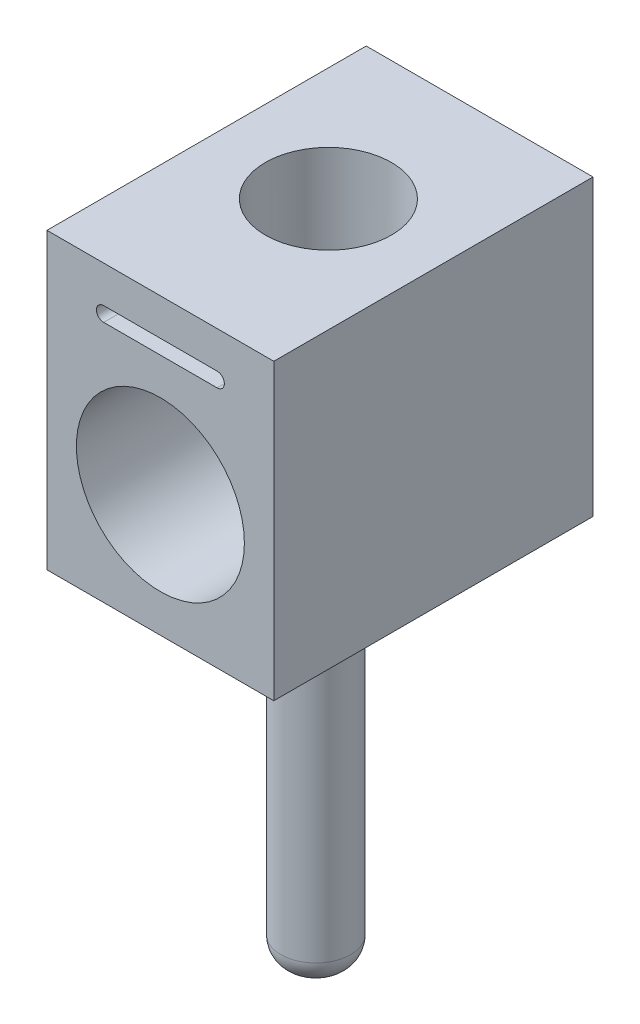
ISO-10303-21;
HEADER;
FILE_DESCRIPTION(('STEP AP214'),'2;1');
FILE_NAME('part.step','',(''),(''),'','','');
FILE_SCHEMA(('AUTOMOTIVE_DESIGN { 1 0 10303 214 1 1 1 1 }'));
ENDSEC;
DATA;
#1=APPLICATION_CONTEXT('core data for automotive mechanical design processes');
#2=APPLICATION_PROTOCOL_DEFINITION('international standard','automotive_design',2000,#1);
#3=PRODUCT_CONTEXT('',#1,'mechanical');
#4=PRODUCT('Part','Part','',(#3));
#5=PRODUCT_RELATED_PRODUCT_CATEGORY('part','',(#4));
#6=PRODUCT_DEFINITION_FORMATION('','',#4);
#7=PRODUCT_DEFINITION_CONTEXT('part definition',#1,'design');
#8=PRODUCT_DEFINITION('design','',#6,#7);
#9=PRODUCT_DEFINITION_SHAPE('','',#8);
#10=(LENGTH_UNIT() NAMED_UNIT(*) SI_UNIT(.MILLI.,.METRE.));
#11=(NAMED_UNIT(*) PLANE_ANGLE_UNIT() SI_UNIT($,.RADIAN.));
#12=(NAMED_UNIT(*) SI_UNIT($,.STERADIAN.) SOLID_ANGLE_UNIT());
#13=UNCERTAINTY_MEASURE_WITH_UNIT(LENGTH_MEASURE(1.E-05),#10,'distance_accuracy_value','');
#14=(GEOMETRIC_REPRESENTATION_CONTEXT(3) GLOBAL_UNCERTAINTY_ASSIGNED_CONTEXT((#13)) GLOBAL_UNIT_ASSIGNED_CONTEXT((#10,
#11,#12)) REPRESENTATION_CONTEXT('',''));
#15=CARTESIAN_POINT('',(0.,0.,0.));
#16=DIRECTION('',(0.,0.,1.));
#17=DIRECTION('',(1.,0.,0.));
#18=AXIS2_PLACEMENT_3D('',#15,#16,#17);
#19=CARTESIAN_POINT('',(-1.35,-1.75,-3.8));
#20=DIRECTION('',(0.,-1.,0.));
#21=DIRECTION('',(0.,0.,-1.));
#22=AXIS2_PLACEMENT_3D('',#19,#20,#21);
#23=PLANE('',#22);
#24=CARTESIAN_POINT('',(0.,-1.75,-1.85));
#25=DIRECTION('',(0.,-1.,0.));
#26=DIRECTION('',(0.,0.,-1.));
#27=AXIS2_PLACEMENT_3D('',#24,#25,#26);
#28=CIRCLE('',#27,0.515);
#29=CARTESIAN_POINT('',(0.,-1.75,-2.365));
#30=VERTEX_POINT('',#29);
#31=EDGE_CURVE('E12',#30,#30,#28,.F.);
#32=ORIENTED_EDGE('',*,*,#31,.T.);
#33=EDGE_LOOP('',(#32));
#34=FACE_BOUND('',#33,.T.);
#35=DIRECTION('',(1.,0.,0.));
#36=VECTOR('',#35,1.);
#37=CARTESIAN_POINT('',(-1.35,-1.75,0.));
#38=LINE('',#37,#36);
#39=CARTESIAN_POINT('',(-1.35,-1.75,0.));
#40=VERTEX_POINT('',#39);
#41=CARTESIAN_POINT('',(1.35,-1.75,0.));
#42=VERTEX_POINT('',#41);
#43=EDGE_CURVE('E158',#40,#42,#38,.T.);
#44=ORIENTED_EDGE('',*,*,#43,.F.);
#45=DIRECTION('',(0.,0.,1.));
#46=VECTOR('',#45,1.);
#47=CARTESIAN_POINT('',(-1.35,-1.75,-3.8));
#48=LINE('',#47,#46);
#49=CARTESIAN_POINT('',(-1.35,-1.75,-3.8));
#50=VERTEX_POINT('',#49);
#51=EDGE_CURVE('E176',#50,#40,#48,.T.);
#52=ORIENTED_EDGE('',*,*,#51,.F.);
#53=DIRECTION('',(1.,0.,0.));
#54=VECTOR('',#53,1.);
#55=CARTESIAN_POINT('',(-1.35,-1.75,-3.8));
#56=LINE('',#55,#54);
#57=CARTESIAN_POINT('',(1.35,-1.75,-3.8));
#58=VERTEX_POINT('',#57);
#59=EDGE_CURVE('E163',#50,#58,#56,.T.);
#60=ORIENTED_EDGE('',*,*,#59,.T.);
#61=DIRECTION('',(0.,0.,1.));
#62=VECTOR('',#61,1.);
#63=CARTESIAN_POINT('',(1.35,-1.75,-3.8));
#64=LINE('',#63,#62);
#65=EDGE_CURVE('E60',#58,#42,#64,.T.);
#66=ORIENTED_EDGE('',*,*,#65,.T.);
#67=EDGE_LOOP('',(#44,#52,#60,#66));
#68=FACE_BOUND('',#67,.T.);
#69=ADVANCED_FACE('F36',(#34,#68),#23,.T.);
#70=CARTESIAN_POINT('',(1.35,1.75,-3.8));
#71=DIRECTION('',(1.,0.,0.));
#72=DIRECTION('',(0.,1.,0.));
#73=AXIS2_PLACEMENT_3D('',#70,#71,#72);
#74=PLANE('',#73);
#75=DIRECTION('',(0.,0.,1.));
#76=VECTOR('',#75,1.);
#77=CARTESIAN_POINT('',(1.35,1.75,-3.8));
#78=LINE('',#77,#76);
#79=CARTESIAN_POINT('',(1.35,1.75,-3.8));
#80=VERTEX_POINT('',#79);
#81=CARTESIAN_POINT('',(1.35,1.75,0.));
#82=VERTEX_POINT('',#81);
#83=EDGE_CURVE('E165',#80,#82,#78,.T.);
#84=ORIENTED_EDGE('',*,*,#83,.T.);
#85=DIRECTION('',(0.,1.,0.));
#86=VECTOR('',#85,1.);
#87=CARTESIAN_POINT('',(1.35,1.75,0.));
#88=LINE('',#87,#86);
#89=EDGE_CURVE('E152',#42,#82,#88,.T.);
#90=ORIENTED_EDGE('',*,*,#89,.F.);
#91=ORIENTED_EDGE('',*,*,#65,.F.);
#92=DIRECTION('',(0.,1.,0.));
#93=VECTOR('',#92,1.);
#94=CARTESIAN_POINT('',(1.35,1.75,-3.8));
#95=LINE('',#94,#93);
#96=EDGE_CURVE('E83',#58,#80,#95,.T.);
#97=ORIENTED_EDGE('',*,*,#96,.T.);
#98=EDGE_LOOP('',(#84,#90,#91,#97));
#99=FACE_BOUND('',#98,.T.);
#100=ADVANCED_FACE('F226',(#99),#74,.T.);
#101=CARTESIAN_POINT('',(-1.35,1.75,-3.8));
#102=DIRECTION('',(-1.,0.,0.));
#103=DIRECTION('',(0.,-1.,0.));
#104=AXIS2_PLACEMENT_3D('',#101,#102,#103);
#105=PLANE('',#104);
#106=DIRECTION('',(0.,-1.,0.));
#107=VECTOR('',#106,1.);
#108=CARTESIAN_POINT('',(-1.35,1.75,-3.8));
#109=LINE('',#108,#107);
#110=CARTESIAN_POINT('',(-1.35,1.75,-3.8));
#111=VERTEX_POINT('',#110);
#112=EDGE_CURVE('E161',#111,#50,#109,.T.);
#113=ORIENTED_EDGE('',*,*,#112,.T.);
#114=ORIENTED_EDGE('',*,*,#51,.T.);
#115=DIRECTION('',(0.,-1.,0.));
#116=VECTOR('',#115,1.);
#117=CARTESIAN_POINT('',(-1.35,1.75,0.));
#118=LINE('',#117,#116);
#119=CARTESIAN_POINT('',(-1.35,1.75,0.));
#120=VERTEX_POINT('',#119);
#121=EDGE_CURVE('E170',#120,#40,#118,.T.);
#122=ORIENTED_EDGE('',*,*,#121,.F.);
#123=DIRECTION('',(0.,0.,1.));
#124=VECTOR('',#123,1.);
#125=CARTESIAN_POINT('',(-1.35,1.75,-3.8));
#126=LINE('',#125,#124);
#127=EDGE_CURVE('E179',#111,#120,#126,.T.);
#128=ORIENTED_EDGE('',*,*,#127,.F.);
#129=EDGE_LOOP('',(#113,#114,#122,#128));
#130=FACE_BOUND('',#129,.T.);
#131=ADVANCED_FACE('F233',(#130),#105,.T.);
#132=CARTESIAN_POINT('',(-1.35,1.75,-3.8));
#133=DIRECTION('',(0.,1.,0.));
#134=DIRECTION('',(0.,0.,1.));
#135=AXIS2_PLACEMENT_3D('',#132,#133,#134);
#136=PLANE('',#135);
#137=CARTESIAN_POINT('',(0.,1.75,-2.));
#138=DIRECTION('',(0.,1.,0.));
#139=DIRECTION('',(0.,0.,1.));
#140=AXIS2_PLACEMENT_3D('',#137,#138,#139);
#141=CIRCLE('',#140,0.75);
#142=CARTESIAN_POINT('',(0.,1.75,-1.25));
#143=VERTEX_POINT('',#142);
#144=EDGE_CURVE('E142',#143,#143,#141,.T.);
#145=ORIENTED_EDGE('',*,*,#144,.F.);
#146=EDGE_LOOP('',(#145));
#147=FACE_BOUND('',#146,.T.);
#148=DIRECTION('',(-1.,0.,0.));
#149=VECTOR('',#148,1.);
#150=CARTESIAN_POINT('',(-1.35,1.75,0.));
#151=LINE('',#150,#149);
#152=EDGE_CURVE('E167',#82,#120,#151,.T.);
#153=ORIENTED_EDGE('',*,*,#152,.F.);
#154=ORIENTED_EDGE('',*,*,#83,.F.);
#155=DIRECTION('',(-1.,0.,0.));
#156=VECTOR('',#155,1.);
#157=CARTESIAN_POINT('',(-1.35,1.75,-3.8));
#158=LINE('',#157,#156);
#159=EDGE_CURVE('E157',#80,#111,#158,.T.);
#160=ORIENTED_EDGE('',*,*,#159,.T.);
#161=ORIENTED_EDGE('',*,*,#127,.T.);
#162=EDGE_LOOP('',(#153,#154,#160,#161));
#163=FACE_BOUND('',#162,.T.);
#164=ADVANCED_FACE('F240',(#147,#163),#136,.T.);
#165=CARTESIAN_POINT('',(0.,0.,-3.8));
#166=DIRECTION('',(0.,0.,1.));
#167=DIRECTION('',(1.,0.,0.));
#168=AXIS2_PLACEMENT_3D('',#165,#166,#167);
#169=PLANE('',#168);
#170=CARTESIAN_POINT('',(0.,-0.3,-3.8));
#171=DIRECTION('',(0.,0.,1.));
#172=DIRECTION('',(1.,0.,0.));
#173=AXIS2_PLACEMENT_3D('',#170,#171,#172);
#174=CIRCLE('',#173,1.);
#175=CARTESIAN_POINT('',(1.,-0.3,-3.8));
#176=VERTEX_POINT('',#175);
#177=EDGE_CURVE('E149',#176,#176,#174,.T.);
#178=ORIENTED_EDGE('',*,*,#177,.T.);
#179=EDGE_LOOP('',(#178));
#180=FACE_BOUND('',#179,.T.);
#181=ORIENTED_EDGE('',*,*,#159,.F.);
#182=ORIENTED_EDGE('',*,*,#96,.F.);
#183=ORIENTED_EDGE('',*,*,#59,.F.);
#184=ORIENTED_EDGE('',*,*,#112,.F.);
#185=EDGE_LOOP('',(#181,#182,#183,#184));
#186=FACE_BOUND('',#185,.T.);
#187=ADVANCED_FACE('F243',(#180,#186),#169,.F.);
#188=CARTESIAN_POINT('',(0.,0.,0.));
#189=DIRECTION('',(0.,0.,1.));
#190=DIRECTION('',(1.,0.,0.));
#191=AXIS2_PLACEMENT_3D('',#188,#189,#190);
#192=PLANE('',#191);
#193=CARTESIAN_POINT('',(-0.675,1.225,0.));
#194=DIRECTION('',(0.,0.,1.));
#195=DIRECTION('',(1.,0.,0.));
#196=AXIS2_PLACEMENT_3D('',#193,#194,#195);
#197=CIRCLE('',#196,0.0864136089338847);
#198=CARTESIAN_POINT('',(-0.675,1.31141360893388,0.));
#199=VERTEX_POINT('',#198);
#200=CARTESIAN_POINT('',(-0.675,1.13858639106611,0.));
#201=VERTEX_POINT('',#200);
#202=EDGE_CURVE('E51',#199,#201,#197,.T.);
#203=ORIENTED_EDGE('',*,*,#202,.F.);
#204=DIRECTION('',(-1.,0.,0.));
#205=VECTOR('',#204,1.);
#206=CARTESIAN_POINT('',(-0.675,1.31141360893388,0.));
#207=LINE('',#206,#205);
#208=CARTESIAN_POINT('',(0.675,1.31141360893388,0.));
#209=VERTEX_POINT('',#208);
#210=EDGE_CURVE('E127',#209,#199,#207,.T.);
#211=ORIENTED_EDGE('',*,*,#210,.F.);
#212=CARTESIAN_POINT('',(0.675,1.225,0.));
#213=DIRECTION('',(0.,0.,1.));
#214=DIRECTION('',(1.,0.,0.));
#215=AXIS2_PLACEMENT_3D('',#212,#213,#214);
#216=CIRCLE('',#215,0.0864136089338847);
#217=CARTESIAN_POINT('',(0.675,1.13858639106612,0.));
#218=VERTEX_POINT('',#217);
#219=EDGE_CURVE('E130',#218,#209,#216,.T.);
#220=ORIENTED_EDGE('',*,*,#219,.F.);
#221=DIRECTION('',(1.,0.,0.));
#222=VECTOR('',#221,1.);
#223=CARTESIAN_POINT('',(-0.675,1.13858639106611,0.));
#224=LINE('',#223,#222);
#225=EDGE_CURVE('E136',#201,#218,#224,.T.);
#226=ORIENTED_EDGE('',*,*,#225,.F.);
#227=EDGE_LOOP('',(#203,#211,#220,#226));
#228=FACE_BOUND('',#227,.T.);
#229=CARTESIAN_POINT('',(0.,-0.3,0.));
#230=DIRECTION('',(0.,0.,1.));
#231=DIRECTION('',(1.,0.,0.));
#232=AXIS2_PLACEMENT_3D('',#229,#230,#231);
#233=CIRCLE('',#232,1.);
#234=CARTESIAN_POINT('',(1.,-0.3,0.));
#235=VERTEX_POINT('',#234);
#236=EDGE_CURVE('E153',#235,#235,#233,.T.);
#237=ORIENTED_EDGE('',*,*,#236,.F.);
#238=EDGE_LOOP('',(#237));
#239=FACE_BOUND('',#238,.T.);
#240=ORIENTED_EDGE('',*,*,#89,.T.);
#241=ORIENTED_EDGE('',*,*,#152,.T.);
#242=ORIENTED_EDGE('',*,*,#121,.T.);
#243=ORIENTED_EDGE('',*,*,#43,.T.);
#244=EDGE_LOOP('',(#240,#241,#242,#243));
#245=FACE_BOUND('',#244,.T.);
#246=ADVANCED_FACE('F237',(#228,#239,#245),#192,.T.);
#247=CARTESIAN_POINT('',(0.,-0.3,-3.8));
#248=DIRECTION('',(0.,0.,1.));
#249=DIRECTION('',(1.,0.,0.));
#250=AXIS2_PLACEMENT_3D('',#247,#248,#249);
#251=CYLINDRICAL_SURFACE('',#250,1.);
#252=CARTESIAN_POINT('',(0.,0.7,-1.25));
#253=CARTESIAN_POINT('',(0.0366202144012363,0.699995549924329,-1.25000473534807));
#254=CARTESIAN_POINT('',(0.0732831719538211,0.697967650692158,-1.25270313962658));
#255=CARTESIAN_POINT('',(0.145465550551888,0.690033614797004,-1.26333290268625));
#256=CARTESIAN_POINT('',(0.180981860536906,0.684117727976345,-1.27127741771765));
#257=CARTESIAN_POINT('',(0.249618016635631,0.668978221133335,-1.29185662173774));
#258=CARTESIAN_POINT('',(0.282750996692572,0.659774718373225,-1.30446280168529));
#259=CARTESIAN_POINT('',(0.346210978824908,0.638752824883222,-1.33377112720603));
#260=CARTESIAN_POINT('',(0.376538798175682,0.626935199195139,-1.35047207457087));
#261=CARTESIAN_POINT('',(0.436733026399872,0.600247710135603,-1.38913151948125));
#262=CARTESIAN_POINT('',(0.466296630176021,0.585196539347365,-1.41143366835905));
#263=CARTESIAN_POINT('',(0.521513568274128,0.553835092817011,-1.45974791498282));
#264=CARTESIAN_POINT('',(0.547160736840208,0.537522891380569,-1.48576574032586));
#265=CARTESIAN_POINT('',(0.599185812622842,0.501355617071726,-1.54679147793153));
#266=CARTESIAN_POINT('',(0.624652893542543,0.481454274009925,-1.58255183890201));
#267=CARTESIAN_POINT('',(0.669309989447192,0.443557223633513,-1.65872550584258));
#268=CARTESIAN_POINT('',(0.688508584605921,0.425558934483913,-1.69913234842712));
#269=CARTESIAN_POINT('',(0.71440313926206,0.399885775857877,-1.76975141938605));
#270=CARTESIAN_POINT('',(0.723128372337555,0.390788755925942,-1.79869534857622));
#271=CARTESIAN_POINT('',(0.737103362769485,0.375857970761133,-1.85819636738046));
#272=CARTESIAN_POINT('',(0.742361076759834,0.370016739542133,-1.88874958893716));
#273=CARTESIAN_POINT('',(0.749064110723876,0.362518798434896,-1.95109129276563));
#274=CARTESIAN_POINT('',(0.750474774282209,0.360900133439581,-1.98288840335078));
#275=CARTESIAN_POINT('',(0.749241066198164,0.362297658823725,-2.04630745545204));
#276=CARTESIAN_POINT('',(0.746595240758686,0.365315510876204,-2.07792933008898));
#277=CARTESIAN_POINT('',(0.737988696485991,0.374838116502368,-2.13659567366212));
#278=CARTESIAN_POINT('',(0.732412431994231,0.380935785974531,-2.16376818535869));
#279=CARTESIAN_POINT('',(0.718528355694913,0.395570964919252,-2.21671943919577));
#280=CARTESIAN_POINT('',(0.710217918434353,0.404110818431617,-2.24249681386061));
#281=CARTESIAN_POINT('',(0.685165320811544,0.42870884610599,-2.30812819341289));
#282=CARTESIAN_POINT('',(0.666400742456174,0.446128245598029,-2.34670020834748));
#283=CARTESIAN_POINT('',(0.623090116586354,0.482666490824355,-2.41959826190876));
#284=CARTESIAN_POINT('',(0.598530021283118,0.501789394457194,-2.45391366962035));
#285=CARTESIAN_POINT('',(0.543258020506854,0.540258361538407,-2.51887669520899));
#286=CARTESIAN_POINT('',(0.512406877629166,0.559597933643939,-2.54941030344265));
#287=CARTESIAN_POINT('',(0.445211260855806,0.596240189912107,-2.60513182338868));
#288=CARTESIAN_POINT('',(0.408877527147119,0.61354674132054,-2.63032996011473));
#289=CARTESIAN_POINT('',(0.338951040226875,0.641398630366826,-2.66999039962053));
#290=CARTESIAN_POINT('',(0.306269935092756,0.652603854724669,-2.68559229710799));
#291=CARTESIAN_POINT('',(0.238176086601093,0.67186452208511,-2.71211244023183));
#292=CARTESIAN_POINT('',(0.202765070531895,0.679921937521858,-2.72303361924961));
#293=CARTESIAN_POINT('',(0.129838116241743,0.692227943179846,-2.73962668144325));
#294=CARTESIAN_POINT('',(0.092310640702966,0.696452964858719,-2.74526608946932));
#295=CARTESIAN_POINT('',(0.0166006198984609,0.70057941829725,-2.75077479868585));
#296=CARTESIAN_POINT('',(-0.0215816421863622,0.700482674227045,-2.75064653434768));
#297=CARTESIAN_POINT('',(-0.093402108664815,0.69621273587936,-2.74494456536341));
#298=CARTESIAN_POINT('',(-0.127111163773068,0.692450433002003,-2.73991973155566));
#299=CARTESIAN_POINT('',(-0.19305533530456,0.68175660100794,-2.72551310999607));
#300=CARTESIAN_POINT('',(-0.225290136493632,0.674824397536309,-2.71613039515529));
#301=CARTESIAN_POINT('',(-0.288708389844886,0.657999153416566,-2.69305623470345));
#302=CARTESIAN_POINT('',(-0.319814586268069,0.648010251450967,-2.6792244092863));
#303=CARTESIAN_POINT('',(-0.379259263521539,0.625834927059812,-2.6479137722872));
#304=CARTESIAN_POINT('',(-0.407597360668208,0.613648200660336,-2.63043445618013));
#305=CARTESIAN_POINT('',(-0.465755813159513,0.585595734432497,-2.58910837679472));
#306=CARTESIAN_POINT('',(-0.495033381349327,0.569455475125192,-2.56468573028126));
#307=CARTESIAN_POINT('',(-0.549359874279295,0.536194764373915,-2.51199562370581));
#308=CARTESIAN_POINT('',(-0.574399152347978,0.519072192536943,-2.48371965015335));
#309=CARTESIAN_POINT('',(-0.62438770537802,0.481845641457518,-2.41792505951937));
#310=CARTESIAN_POINT('',(-0.648415218243071,0.461793592600648,-2.37967121925368));
#311=CARTESIAN_POINT('',(-0.689616179991866,0.424702956742105,-2.29831996101394));
#312=CARTESIAN_POINT('',(-0.706810002579291,0.407655497854296,-2.25523743904634));
#313=CARTESIAN_POINT('',(-0.728078671282801,0.385594389043247,-2.18229277556238));
#314=CARTESIAN_POINT('',(-0.734655047561809,0.378479059123847,-2.15380443679764));
#315=CARTESIAN_POINT('',(-0.744457610912695,0.367710280514029,-2.09564647650957));
#316=CARTESIAN_POINT('',(-0.747691276007807,0.364049106097411,-2.06597964660315));
#317=CARTESIAN_POINT('',(-0.750576601033655,0.360788008964814,-2.00608546009004));
#318=CARTESIAN_POINT('',(-0.750210076582722,0.361208703438968,-1.97585602847917));
#319=CARTESIAN_POINT('',(-0.74588441923474,0.36608224270422,-1.91597158063999));
#320=CARTESIAN_POINT('',(-0.741920650285916,0.370540290734719,-1.88631735611138));
#321=CARTESIAN_POINT('',(-0.729469208900039,0.384086744053065,-1.8220427142215));
#322=CARTESIAN_POINT('',(-0.720182838954333,0.393973530017116,-1.78775140963312));
#323=CARTESIAN_POINT('',(-0.697348137148892,0.416914816662478,-1.72173257588601));
#324=CARTESIAN_POINT('',(-0.683789039566413,0.42997729973955,-1.69001178011397));
#325=CARTESIAN_POINT('',(-0.647494590522783,0.462582387984412,-1.61873968323072));
#326=CARTESIAN_POINT('',(-0.62320769235656,0.482801021766621,-1.58028920200535));
#327=CARTESIAN_POINT('',(-0.568253610319043,0.52356754509007,-1.50843698413391));
#328=CARTESIAN_POINT('',(-0.53758074162965,0.54411571283823,-1.47503979200132));
#329=CARTESIAN_POINT('',(-0.469813504073434,0.583644966812501,-1.41358405367889));
#330=CARTESIAN_POINT('',(-0.432668324359605,0.602611751461281,-1.38557174591106));
#331=CARTESIAN_POINT('',(-0.35257980527157,0.636786365634487,-1.33638856860002));
#332=CARTESIAN_POINT('',(-0.309650664114993,0.652003149546709,-1.31520136389219));
#333=CARTESIAN_POINT('',(-0.232419470733686,0.673183741180643,-1.28610004121395));
#334=CARTESIAN_POINT('',(-0.19927463266858,0.680552315625429,-1.27611583370066));
#335=CARTESIAN_POINT('',(-0.131422973804692,0.691917998699978,-1.26079184705597));
#336=CARTESIAN_POINT('',(-0.0967208035042929,0.695924522226515,-1.25543909693557));
#337=CARTESIAN_POINT('',(-0.0412269601856745,0.699363449511954,-1.25084873150009));
#338=CARTESIAN_POINT('',(-0.020620256240996,0.70000250576634,-1.24999733360134));
#339=CARTESIAN_POINT('',(0.,0.7,-1.25));
#340=B_SPLINE_CURVE_WITH_KNOTS('',3,(#252,#253,#254,#255,#256,#257,#258,#259,#260,#261,#262,
#263,#264,#265,#266,#267,#268,#269,#270,#271,#272,#273,#274,#275,#276,#277,#278,#279,#280,#281,
#282,#283,#284,#285,#286,#287,#288,#289,#290,#291,#292,#293,#294,#295,#296,#297,#298,#299,#300,
#301,#302,#303,#304,#305,#306,#307,#308,#309,#310,#311,#312,#313,#314,#315,#316,#317,#318,#319,
#320,#321,#322,#323,#324,#325,#326,#327,#328,#329,#330,#331,#332,#333,#334,#335,#336,#337,#338,
#339),.UNSPECIFIED.,.T.,.F.,(4,2,2,2,2,2,2,2,2,2,2,2,2,2,2,2,2,2,2,2,2,2,2,2,2,2,2,2,2,2,2,2,2,
2,2,2,2,2,2,2,2,2,2,4),(0.,0.109785893286021,0.219848159711622,0.329248166786691,
0.438616199424646,0.558112156587148,0.677794342025812,0.821800079437255,0.965607870282533,
1.05999759264951,1.15416996597645,1.24918793810628,1.34423997150105,1.42913445078177,
1.51411068794507,1.65224665897142,1.79072096173131,1.93267941963232,2.07436331241032,
2.18763252497381,2.30083064815745,2.41472029077636,2.52856186227493,2.63095593500184,
2.73337180087093,2.83940219736027,2.94544726982957,3.06920191035121,3.19323454486913,
3.3408429800216,3.48800797919243,3.57794580705653,3.66768199551291,3.75787166921557,
3.84817774276114,3.95819835474254,4.06849842564147,4.21706123322071,4.36575686189633,
4.51567724740512,4.66523610130769,4.77097848765001,4.87642376135815,4.93824243959963),.UNSPECIFIED.);
#341=CARTESIAN_POINT('',(0.,0.7,-1.25));
#342=VERTEX_POINT('',#341);
#343=EDGE_CURVE('E148',#342,#342,#340,.T.);
#344=ORIENTED_EDGE('',*,*,#343,.T.);
#345=EDGE_LOOP('',(#344));
#346=FACE_BOUND('',#345,.T.);
#347=ORIENTED_EDGE('',*,*,#177,.F.);
#348=EDGE_LOOP('',(#347));
#349=FACE_BOUND('',#348,.T.);
#350=ORIENTED_EDGE('',*,*,#236,.T.);
#351=EDGE_LOOP('',(#350));
#352=FACE_BOUND('',#351,.T.);
#353=ADVANCED_FACE('F189',(#346,#349,#352),#251,.F.);
#354=CARTESIAN_POINT('',(0.,-0.0999999999999983,-2.));
#355=DIRECTION('',(0.,1.,0.));
#356=DIRECTION('',(0.,0.,1.));
#357=AXIS2_PLACEMENT_3D('',#354,#355,#356);
#358=CYLINDRICAL_SURFACE('',#357,0.75);
#359=ORIENTED_EDGE('',*,*,#144,.T.);
#360=EDGE_LOOP('',(#359));
#361=FACE_BOUND('',#360,.T.);
#362=ORIENTED_EDGE('',*,*,#343,.F.);
#363=EDGE_LOOP('',(#362));
#364=FACE_BOUND('',#363,.T.);
#365=ADVANCED_FACE('F192',(#361,#364),#358,.F.);
#366=CARTESIAN_POINT('',(-0.675,1.225,-0.5));
#367=DIRECTION('',(0.,0.,1.));
#368=DIRECTION('',(1.,0.,0.));
#369=AXIS2_PLACEMENT_3D('',#366,#367,#368);
#370=CYLINDRICAL_SURFACE('',#369,0.0864136089338847);
#371=ORIENTED_EDGE('',*,*,#202,.T.);
#372=DIRECTION('',(0.,0.,1.));
#373=VECTOR('',#372,1.);
#374=CARTESIAN_POINT('',(-0.675,1.13858639106611,-0.5));
#375=LINE('',#374,#373);
#376=CARTESIAN_POINT('',(-0.675,1.13858639106611,-0.5));
#377=VERTEX_POINT('',#376);
#378=EDGE_CURVE('E105',#377,#201,#375,.T.);
#379=ORIENTED_EDGE('',*,*,#378,.F.);
#380=CARTESIAN_POINT('',(-0.675,1.225,-0.5));
#381=DIRECTION('',(0.,0.,1.));
#382=DIRECTION('',(1.,0.,0.));
#383=AXIS2_PLACEMENT_3D('',#380,#381,#382);
#384=CIRCLE('',#383,0.0864136089338847);
#385=CARTESIAN_POINT('',(-0.675,1.31141360893388,-0.5));
#386=VERTEX_POINT('',#385);
#387=EDGE_CURVE('E109',#386,#377,#384,.T.);
#388=ORIENTED_EDGE('',*,*,#387,.F.);
#389=DIRECTION('',(0.,0.,1.));
#390=VECTOR('',#389,1.);
#391=CARTESIAN_POINT('',(-0.675,1.31141360893388,-0.5));
#392=LINE('',#391,#390);
#393=EDGE_CURVE('E140',#386,#199,#392,.T.);
#394=ORIENTED_EDGE('',*,*,#393,.T.);
#395=EDGE_LOOP('',(#371,#379,#388,#394));
#396=FACE_BOUND('',#395,.T.);
#397=ADVANCED_FACE('F107',(#396),#370,.F.);
#398=CARTESIAN_POINT('',(-0.675,1.31141360893388,-0.5));
#399=DIRECTION('',(0.,1.,0.));
#400=DIRECTION('',(-1.,0.,0.));
#401=AXIS2_PLACEMENT_3D('',#398,#399,#400);
#402=PLANE('',#401);
#403=ORIENTED_EDGE('',*,*,#210,.T.);
#404=ORIENTED_EDGE('',*,*,#393,.F.);
#405=DIRECTION('',(-1.,0.,0.));
#406=VECTOR('',#405,1.);
#407=CARTESIAN_POINT('',(-0.675,1.31141360893388,-0.5));
#408=LINE('',#407,#406);
#409=CARTESIAN_POINT('',(0.675,1.31141360893388,-0.5));
#410=VERTEX_POINT('',#409);
#411=EDGE_CURVE('E115',#410,#386,#408,.T.);
#412=ORIENTED_EDGE('',*,*,#411,.F.);
#413=DIRECTION('',(0.,0.,1.));
#414=VECTOR('',#413,1.);
#415=CARTESIAN_POINT('',(0.675,1.31141360893388,-0.5));
#416=LINE('',#415,#414);
#417=EDGE_CURVE('E143',#410,#209,#416,.T.);
#418=ORIENTED_EDGE('',*,*,#417,.T.);
#419=EDGE_LOOP('',(#403,#404,#412,#418));
#420=FACE_BOUND('',#419,.T.);
#421=ADVANCED_FACE('F199',(#420),#402,.F.);
#422=CARTESIAN_POINT('',(0.675,1.225,-0.5));
#423=DIRECTION('',(0.,0.,1.));
#424=DIRECTION('',(1.,0.,0.));
#425=AXIS2_PLACEMENT_3D('',#422,#423,#424);
#426=CYLINDRICAL_SURFACE('',#425,0.0864136089338847);
#427=ORIENTED_EDGE('',*,*,#219,.T.);
#428=ORIENTED_EDGE('',*,*,#417,.F.);
#429=CARTESIAN_POINT('',(0.675,1.225,-0.5));
#430=DIRECTION('',(0.,0.,1.));
#431=DIRECTION('',(1.,0.,0.));
#432=AXIS2_PLACEMENT_3D('',#429,#430,#431);
#433=CIRCLE('',#432,0.0864136089338847);
#434=CARTESIAN_POINT('',(0.675,1.13858639106612,-0.5));
#435=VERTEX_POINT('',#434);
#436=EDGE_CURVE('E123',#435,#410,#433,.T.);
#437=ORIENTED_EDGE('',*,*,#436,.F.);
#438=DIRECTION('',(0.,0.,1.));
#439=VECTOR('',#438,1.);
#440=CARTESIAN_POINT('',(0.675,1.13858639106612,-0.5));
#441=LINE('',#440,#439);
#442=EDGE_CURVE('E114',#435,#218,#441,.T.);
#443=ORIENTED_EDGE('',*,*,#442,.T.);
#444=EDGE_LOOP('',(#427,#428,#437,#443));
#445=FACE_BOUND('',#444,.T.);
#446=ADVANCED_FACE('F202',(#445),#426,.F.);
#447=CARTESIAN_POINT('',(-0.675,1.13858639106611,-0.5));
#448=DIRECTION('',(0.,-1.,0.));
#449=DIRECTION('',(1.,0.,0.));
#450=AXIS2_PLACEMENT_3D('',#447,#448,#449);
#451=PLANE('',#450);
#452=ORIENTED_EDGE('',*,*,#225,.T.);
#453=ORIENTED_EDGE('',*,*,#442,.F.);
#454=DIRECTION('',(1.,0.,0.));
#455=VECTOR('',#454,1.);
#456=CARTESIAN_POINT('',(-0.675,1.13858639106611,-0.5));
#457=LINE('',#456,#455);
#458=EDGE_CURVE('E118',#377,#435,#457,.T.);
#459=ORIENTED_EDGE('',*,*,#458,.F.);
#460=ORIENTED_EDGE('',*,*,#378,.T.);
#461=EDGE_LOOP('',(#452,#453,#459,#460));
#462=FACE_BOUND('',#461,.T.);
#463=ADVANCED_FACE('F119',(#462),#451,.F.);
#464=CARTESIAN_POINT('',(-0.675,1.225,-0.5));
#465=DIRECTION('',(0.,0.,1.));
#466=DIRECTION('',(1.,0.,0.));
#467=AXIS2_PLACEMENT_3D('',#464,#465,#466);
#468=PLANE('',#467);
#469=ORIENTED_EDGE('',*,*,#387,.T.);
#470=ORIENTED_EDGE('',*,*,#458,.T.);
#471=ORIENTED_EDGE('',*,*,#436,.T.);
#472=ORIENTED_EDGE('',*,*,#411,.T.);
#473=EDGE_LOOP('',(#469,#470,#471,#472));
#474=FACE_BOUND('',#473,.T.);
#475=ADVANCED_FACE('F125',(#474),#468,.T.);
#476=CARTESIAN_POINT('',(0.,-6.06,-1.85));
#477=DIRECTION('',(0.,1.,0.));
#478=DIRECTION('',(0.,0.,1.));
#479=AXIS2_PLACEMENT_3D('',#476,#477,#478);
#480=CYLINDRICAL_SURFACE('',#479,0.415);
#481=CARTESIAN_POINT('',(0.,-1.85,-1.85));
#482=DIRECTION('',(0.,-1.,0.));
#483=DIRECTION('',(0.,0.,-1.));
#484=AXIS2_PLACEMENT_3D('',#481,#482,#483);
#485=CIRCLE('',#484,0.415);
#486=CARTESIAN_POINT('',(0.,-1.85,-2.265));
#487=VERTEX_POINT('',#486);
#488=EDGE_CURVE('E44',#487,#487,#485,.T.);
#489=ORIENTED_EDGE('',*,*,#488,.T.);
#490=EDGE_LOOP('',(#489));
#491=FACE_BOUND('',#490,.T.);
#492=CARTESIAN_POINT('',(0.,-5.76,-1.85));
#493=DIRECTION('',(0.,-1.,0.));
#494=DIRECTION('',(0.,0.,-1.));
#495=AXIS2_PLACEMENT_3D('',#492,#493,#494);
#496=CIRCLE('',#495,0.415);
#497=CARTESIAN_POINT('',(0.,-5.76,-2.265));
#498=VERTEX_POINT('',#497);
#499=EDGE_CURVE('E336',#498,#498,#496,.F.);
#500=ORIENTED_EDGE('',*,*,#499,.T.);
#501=EDGE_LOOP('',(#500));
#502=FACE_BOUND('',#501,.T.);
#503=ADVANCED_FACE('F211',(#491,#502),#480,.T.);
#504=CARTESIAN_POINT('',(0.,-6.06,-1.85));
#505=DIRECTION('',(0.,-1.,0.));
#506=DIRECTION('',(0.,0.,-1.));
#507=AXIS2_PLACEMENT_3D('',#504,#505,#506);
#508=PLANE('',#507);
#509=CARTESIAN_POINT('',(0.,-6.06,-1.85));
#510=DIRECTION('',(0.,-1.,0.));
#511=DIRECTION('',(0.,0.,-1.));
#512=AXIS2_PLACEMENT_3D('',#509,#510,#511);
#513=CIRCLE('',#512,0.115);
#514=CARTESIAN_POINT('',(0.,-6.06,-1.965));
#515=VERTEX_POINT('',#514);
#516=EDGE_CURVE('E175',#515,#515,#513,.T.);
#517=ORIENTED_EDGE('',*,*,#516,.T.);
#518=EDGE_LOOP('',(#517));
#519=FACE_BOUND('',#518,.T.);
#520=ADVANCED_FACE('F214',(#519),#508,.T.);
#521=CARTESIAN_POINT('',(0.,-5.76,-1.85));
#522=DIRECTION('',(0.,-1.,0.));
#523=DIRECTION('',(0.,0.,-1.));
#524=AXIS2_PLACEMENT_3D('',#521,#522,#523);
#525=DEGENERATE_TOROIDAL_SURFACE('',#524,0.115,0.3,.T.);
#526=ORIENTED_EDGE('',*,*,#499,.F.);
#527=EDGE_LOOP('',(#526));
#528=FACE_BOUND('',#527,.T.);
#529=ORIENTED_EDGE('',*,*,#516,.F.);
#530=EDGE_LOOP('',(#529));
#531=FACE_BOUND('',#530,.T.);
#532=ADVANCED_FACE('F217',(#528,#531),#525,.T.);
#533=CARTESIAN_POINT('',(0.,-1.85,-1.85));
#534=DIRECTION('',(0.,-1.,0.));
#535=DIRECTION('',(0.,0.,-1.));
#536=AXIS2_PLACEMENT_3D('',#533,#534,#535);
#537=TOROIDAL_SURFACE('',#536,0.515,0.1);
#538=ORIENTED_EDGE('',*,*,#31,.F.);
#539=EDGE_LOOP('',(#538));
#540=FACE_BOUND('',#539,.T.);
#541=ORIENTED_EDGE('',*,*,#488,.F.);
#542=EDGE_LOOP('',(#541));
#543=FACE_BOUND('',#542,.T.);
#544=ADVANCED_FACE('F38',(#540,#543),#537,.F.);
#545=CLOSED_SHELL('',(#69,#100,#131,#164,#187,#246,#353,#365,#397,#421,#446,#463,#475,#503,#520,
#532,#544));
#546=MANIFOLD_SOLID_BREP('B2',#545);
#547=ADVANCED_BREP_SHAPE_REPRESENTATION('',(#18,#546),#14);
#548=SHAPE_DEFINITION_REPRESENTATION(#9,#547);
ENDSEC;
END-ISO-10303-21;
